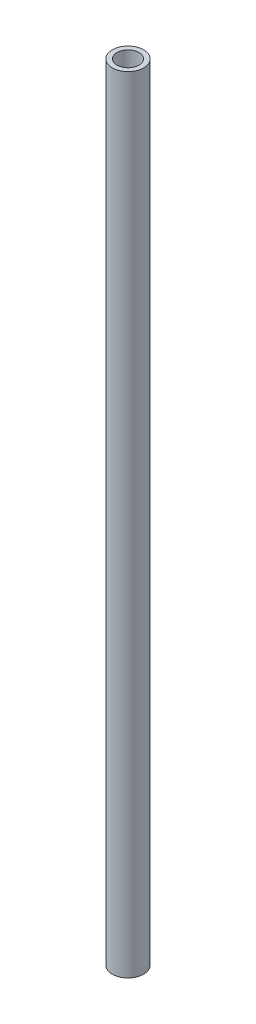
ISO-10303-21;
HEADER;
FILE_DESCRIPTION(('STEP AP214'),'2;1');
FILE_NAME('part.step','',(''),(''),'','','');
FILE_SCHEMA(('AUTOMOTIVE_DESIGN { 1 0 10303 214 1 1 1 1 }'));
ENDSEC;
DATA;
#1=APPLICATION_CONTEXT('core data for automotive mechanical design processes');
#2=APPLICATION_PROTOCOL_DEFINITION('international standard','automotive_design',2000,#1);
#3=PRODUCT_CONTEXT('',#1,'mechanical');
#4=PRODUCT('Part','Part','',(#3));
#5=PRODUCT_RELATED_PRODUCT_CATEGORY('part','',(#4));
#6=PRODUCT_DEFINITION_FORMATION('','',#4);
#7=PRODUCT_DEFINITION_CONTEXT('part definition',#1,'design');
#8=PRODUCT_DEFINITION('design','',#6,#7);
#9=PRODUCT_DEFINITION_SHAPE('','',#8);
#10=(LENGTH_UNIT() NAMED_UNIT(*) SI_UNIT(.MILLI.,.METRE.));
#11=(NAMED_UNIT(*) PLANE_ANGLE_UNIT() SI_UNIT($,.RADIAN.));
#12=(NAMED_UNIT(*) SI_UNIT($,.STERADIAN.) SOLID_ANGLE_UNIT());
#13=UNCERTAINTY_MEASURE_WITH_UNIT(LENGTH_MEASURE(1.E-05),#10,'distance_accuracy_value','');
#14=(GEOMETRIC_REPRESENTATION_CONTEXT(3) GLOBAL_UNCERTAINTY_ASSIGNED_CONTEXT((#13)) GLOBAL_UNIT_ASSIGNED_CONTEXT((#10,
#11,#12)) REPRESENTATION_CONTEXT('',''));
#15=CARTESIAN_POINT('',(0.,0.,0.));
#16=DIRECTION('',(0.,0.,1.));
#17=DIRECTION('',(1.,0.,0.));
#18=AXIS2_PLACEMENT_3D('',#15,#16,#17);
#19=CARTESIAN_POINT('',(0.,250.,0.));
#20=DIRECTION('',(0.,1.,0.));
#21=DIRECTION('',(0.,0.,1.));
#22=AXIS2_PLACEMENT_3D('',#19,#20,#21);
#23=PLANE('',#22);
#24=CARTESIAN_POINT('',(0.,250.,0.));
#25=DIRECTION('',(0.,1.,0.));
#26=DIRECTION('',(0.,0.,1.));
#27=AXIS2_PLACEMENT_3D('',#24,#25,#26);
#28=CIRCLE('',#27,5.);
#29=CARTESIAN_POINT('',(0.,250.,5.));
#30=VERTEX_POINT('',#29);
#31=EDGE_CURVE('E10',#30,#30,#28,.T.);
#32=ORIENTED_EDGE('',*,*,#31,.T.);
#33=EDGE_LOOP('',(#32));
#34=FACE_BOUND('',#33,.T.);
#35=CARTESIAN_POINT('',(0.,250.,0.));
#36=DIRECTION('',(0.,1.,0.));
#37=DIRECTION('',(0.,0.,1.));
#38=AXIS2_PLACEMENT_3D('',#35,#36,#37);
#39=CIRCLE('',#38,3.5);
#40=CARTESIAN_POINT('',(0.,250.,3.5));
#41=VERTEX_POINT('',#40);
#42=EDGE_CURVE('E45',#41,#41,#39,.T.);
#43=ORIENTED_EDGE('',*,*,#42,.F.);
#44=EDGE_LOOP('',(#43));
#45=FACE_BOUND('',#44,.T.);
#46=ADVANCED_FACE('F34',(#34,#45),#23,.T.);
#47=CARTESIAN_POINT('',(0.,0.,0.));
#48=DIRECTION('',(0.,1.,0.));
#49=DIRECTION('',(0.,0.,1.));
#50=AXIS2_PLACEMENT_3D('',#47,#48,#49);
#51=PLANE('',#50);
#52=CARTESIAN_POINT('',(0.,0.,0.));
#53=DIRECTION('',(0.,1.,0.));
#54=DIRECTION('',(0.,0.,1.));
#55=AXIS2_PLACEMENT_3D('',#52,#53,#54);
#56=CIRCLE('',#55,5.);
#57=CARTESIAN_POINT('',(0.,0.,5.));
#58=VERTEX_POINT('',#57);
#59=EDGE_CURVE('E38',#58,#58,#56,.T.);
#60=ORIENTED_EDGE('',*,*,#59,.F.);
#61=EDGE_LOOP('',(#60));
#62=FACE_BOUND('',#61,.T.);
#63=CARTESIAN_POINT('',(0.,0.,0.));
#64=DIRECTION('',(0.,1.,0.));
#65=DIRECTION('',(0.,0.,1.));
#66=AXIS2_PLACEMENT_3D('',#63,#64,#65);
#67=CIRCLE('',#66,3.5);
#68=CARTESIAN_POINT('',(0.,0.,3.5));
#69=VERTEX_POINT('',#68);
#70=EDGE_CURVE('E47',#69,#69,#67,.T.);
#71=ORIENTED_EDGE('',*,*,#70,.T.);
#72=EDGE_LOOP('',(#71));
#73=FACE_BOUND('',#72,.T.);
#74=ADVANCED_FACE('F57',(#62,#73),#51,.F.);
#75=CARTESIAN_POINT('',(0.,250.,0.));
#76=DIRECTION('',(0.,-1.,0.));
#77=DIRECTION('',(0.,0.,-1.));
#78=AXIS2_PLACEMENT_3D('',#75,#76,#77);
#79=CYLINDRICAL_SURFACE('',#78,5.);
#80=ORIENTED_EDGE('',*,*,#31,.F.);
#81=EDGE_LOOP('',(#80));
#82=FACE_BOUND('',#81,.T.);
#83=ORIENTED_EDGE('',*,*,#59,.T.);
#84=EDGE_LOOP('',(#83));
#85=FACE_BOUND('',#84,.T.);
#86=ADVANCED_FACE('F36',(#82,#85),#79,.T.);
#87=CARTESIAN_POINT('',(0.,250.,0.));
#88=DIRECTION('',(0.,-1.,0.));
#89=DIRECTION('',(0.,0.,-1.));
#90=AXIS2_PLACEMENT_3D('',#87,#88,#89);
#91=CYLINDRICAL_SURFACE('',#90,3.5);
#92=ORIENTED_EDGE('',*,*,#42,.T.);
#93=EDGE_LOOP('',(#92));
#94=FACE_BOUND('',#93,.T.);
#95=ORIENTED_EDGE('',*,*,#70,.F.);
#96=EDGE_LOOP('',(#95));
#97=FACE_BOUND('',#96,.T.);
#98=ADVANCED_FACE('F53',(#94,#97),#91,.F.);
#99=CLOSED_SHELL('',(#46,#74,#86,#98));
#100=MANIFOLD_SOLID_BREP('B2',#99);
#101=ADVANCED_BREP_SHAPE_REPRESENTATION('',(#18,#100),#14);
#102=SHAPE_DEFINITION_REPRESENTATION(#9,#101);
ENDSEC;
END-ISO-10303-21;
